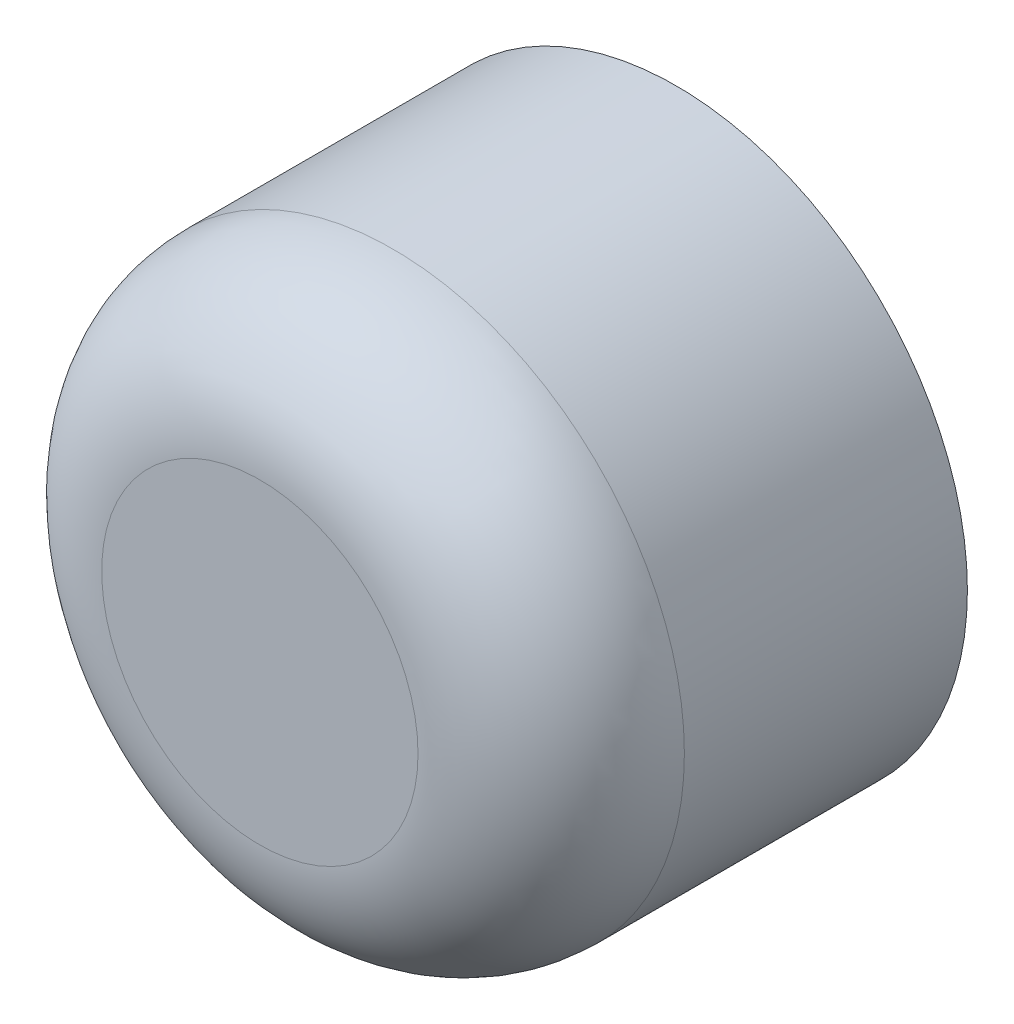
ISO-10303-21;
HEADER;
FILE_DESCRIPTION(('STEP AP214'),'2;1');
FILE_NAME('part.step','',(''),(''),'','','');
FILE_SCHEMA(('AUTOMOTIVE_DESIGN { 1 0 10303 214 1 1 1 1 }'));
ENDSEC;
DATA;
#1=APPLICATION_CONTEXT('core data for automotive mechanical design processes');
#2=APPLICATION_PROTOCOL_DEFINITION('international standard','automotive_design',2000,#1);
#3=PRODUCT_CONTEXT('',#1,'mechanical');
#4=PRODUCT('Part','Part','',(#3));
#5=PRODUCT_RELATED_PRODUCT_CATEGORY('part','',(#4));
#6=PRODUCT_DEFINITION_FORMATION('','',#4);
#7=PRODUCT_DEFINITION_CONTEXT('part definition',#1,'design');
#8=PRODUCT_DEFINITION('design','',#6,#7);
#9=PRODUCT_DEFINITION_SHAPE('','',#8);
#10=(LENGTH_UNIT() NAMED_UNIT(*) SI_UNIT(.MILLI.,.METRE.));
#11=(NAMED_UNIT(*) PLANE_ANGLE_UNIT() SI_UNIT($,.RADIAN.));
#12=(NAMED_UNIT(*) SI_UNIT($,.STERADIAN.) SOLID_ANGLE_UNIT());
#13=UNCERTAINTY_MEASURE_WITH_UNIT(LENGTH_MEASURE(1.E-05),#10,'distance_accuracy_value','');
#14=(GEOMETRIC_REPRESENTATION_CONTEXT(3) GLOBAL_UNCERTAINTY_ASSIGNED_CONTEXT((#13)) GLOBAL_UNIT_ASSIGNED_CONTEXT((#10,
#11,#12)) REPRESENTATION_CONTEXT('',''));
#15=CARTESIAN_POINT('',(0.,0.,0.));
#16=DIRECTION('',(0.,0.,1.));
#17=DIRECTION('',(1.,0.,0.));
#18=AXIS2_PLACEMENT_3D('',#15,#16,#17);
#19=CARTESIAN_POINT('',(0.,0.,0.));
#20=DIRECTION('',(0.,0.,1.));
#21=DIRECTION('',(1.,0.,0.));
#22=AXIS2_PLACEMENT_3D('',#19,#20,#21);
#23=PLANE('',#22);
#24=CARTESIAN_POINT('',(0.,0.,0.));
#25=DIRECTION('',(0.,0.,1.));
#26=DIRECTION('',(1.,0.,0.));
#27=AXIS2_PLACEMENT_3D('',#24,#25,#26);
#28=CIRCLE('',#27,17.5);
#29=CARTESIAN_POINT('',(17.5,0.,0.));
#30=VERTEX_POINT('',#29);
#31=EDGE_CURVE('E48',#30,#30,#28,.T.);
#32=ORIENTED_EDGE('',*,*,#31,.F.);
#33=EDGE_LOOP('',(#32));
#34=FACE_BOUND('',#33,.T.);
#35=CARTESIAN_POINT('',(0.,0.,0.));
#36=DIRECTION('',(0.,0.,1.));
#37=DIRECTION('',(1.,0.,0.));
#38=AXIS2_PLACEMENT_3D('',#35,#36,#37);
#39=CIRCLE('',#38,12.5);
#40=CARTESIAN_POINT('',(12.5,0.,0.));
#41=VERTEX_POINT('',#40);
#42=EDGE_CURVE('E52',#41,#41,#39,.T.);
#43=ORIENTED_EDGE('',*,*,#42,.T.);
#44=EDGE_LOOP('',(#43));
#45=FACE_BOUND('',#44,.T.);
#46=ADVANCED_FACE('F37',(#34,#45),#23,.F.);
#47=CARTESIAN_POINT('',(0.,0.,20.));
#48=DIRECTION('',(0.,0.,-1.));
#49=DIRECTION('',(-1.,0.,0.));
#50=AXIS2_PLACEMENT_3D('',#47,#48,#49);
#51=CYLINDRICAL_SURFACE('',#50,17.5);
#52=CARTESIAN_POINT('',(0.,0.,17.));
#53=DIRECTION('',(0.,0.,1.));
#54=DIRECTION('',(1.,0.,0.));
#55=AXIS2_PLACEMENT_3D('',#52,#53,#54);
#56=CIRCLE('',#55,17.5);
#57=CARTESIAN_POINT('',(17.5,0.,17.));
#58=VERTEX_POINT('',#57);
#59=EDGE_CURVE('E10',#58,#58,#56,.F.);
#60=ORIENTED_EDGE('',*,*,#59,.T.);
#61=EDGE_LOOP('',(#60));
#62=FACE_BOUND('',#61,.T.);
#63=ORIENTED_EDGE('',*,*,#31,.T.);
#64=EDGE_LOOP('',(#63));
#65=FACE_BOUND('',#64,.T.);
#66=ADVANCED_FACE('F73',(#62,#65),#51,.T.);
#67=CARTESIAN_POINT('',(0.,0.,20.));
#68=DIRECTION('',(0.,0.,-1.));
#69=DIRECTION('',(-1.,0.,0.));
#70=AXIS2_PLACEMENT_3D('',#67,#68,#69);
#71=CYLINDRICAL_SURFACE('',#70,12.5);
#72=CARTESIAN_POINT('',(0.,0.,20.));
#73=DIRECTION('',(0.,0.,1.));
#74=DIRECTION('',(1.,0.,0.));
#75=AXIS2_PLACEMENT_3D('',#72,#73,#74);
#76=CIRCLE('',#75,12.5);
#77=CARTESIAN_POINT('',(12.5,0.,20.));
#78=VERTEX_POINT('',#77);
#79=EDGE_CURVE('E57',#78,#78,#76,.T.);
#80=ORIENTED_EDGE('',*,*,#79,.T.);
#81=EDGE_LOOP('',(#80));
#82=FACE_BOUND('',#81,.T.);
#83=ORIENTED_EDGE('',*,*,#42,.F.);
#84=EDGE_LOOP('',(#83));
#85=FACE_BOUND('',#84,.T.);
#86=ADVANCED_FACE('F61',(#82,#85),#71,.F.);
#87=CARTESIAN_POINT('',(0.,0.,20.));
#88=DIRECTION('',(0.,0.,1.));
#89=DIRECTION('',(1.,0.,0.));
#90=AXIS2_PLACEMENT_3D('',#87,#88,#89);
#91=PLANE('',#90);
#92=ORIENTED_EDGE('',*,*,#79,.F.);
#93=EDGE_LOOP('',(#92));
#94=FACE_BOUND('',#93,.T.);
#95=ADVANCED_FACE('F64',(#94),#91,.F.);
#96=CARTESIAN_POINT('',(0.,0.,25.));
#97=DIRECTION('',(0.,0.,1.));
#98=DIRECTION('',(1.,0.,0.));
#99=AXIS2_PLACEMENT_3D('',#96,#97,#98);
#100=PLANE('',#99);
#101=CARTESIAN_POINT('',(0.,0.,25.));
#102=DIRECTION('',(0.,0.,1.));
#103=DIRECTION('',(1.,0.,0.));
#104=AXIS2_PLACEMENT_3D('',#101,#102,#103);
#105=CIRCLE('',#104,9.50000000000001);
#106=CARTESIAN_POINT('',(9.50000000000001,0.,25.));
#107=VERTEX_POINT('',#106);
#108=EDGE_CURVE('E44',#107,#107,#105,.T.);
#109=ORIENTED_EDGE('',*,*,#108,.T.);
#110=EDGE_LOOP('',(#109));
#111=FACE_BOUND('',#110,.T.);
#112=ADVANCED_FACE('F66',(#111),#100,.T.);
#113=CARTESIAN_POINT('',(0.,0.,17.));
#114=DIRECTION('',(0.,0.,1.));
#115=DIRECTION('',(1.,0.,0.));
#116=AXIS2_PLACEMENT_3D('',#113,#114,#115);
#117=TOROIDAL_SURFACE('',#116,9.50000000000001,8.);
#118=ORIENTED_EDGE('',*,*,#59,.F.);
#119=EDGE_LOOP('',(#118));
#120=FACE_BOUND('',#119,.T.);
#121=ORIENTED_EDGE('',*,*,#108,.F.);
#122=EDGE_LOOP('',(#121));
#123=FACE_BOUND('',#122,.T.);
#124=ADVANCED_FACE('F39',(#120,#123),#117,.T.);
#125=CLOSED_SHELL('',(#46,#66,#86,#95,#112,#124));
#126=MANIFOLD_SOLID_BREP('B2',#125);
#127=ADVANCED_BREP_SHAPE_REPRESENTATION('',(#18,#126),#14);
#128=SHAPE_DEFINITION_REPRESENTATION(#9,#127);
ENDSEC;
END-ISO-10303-21;
